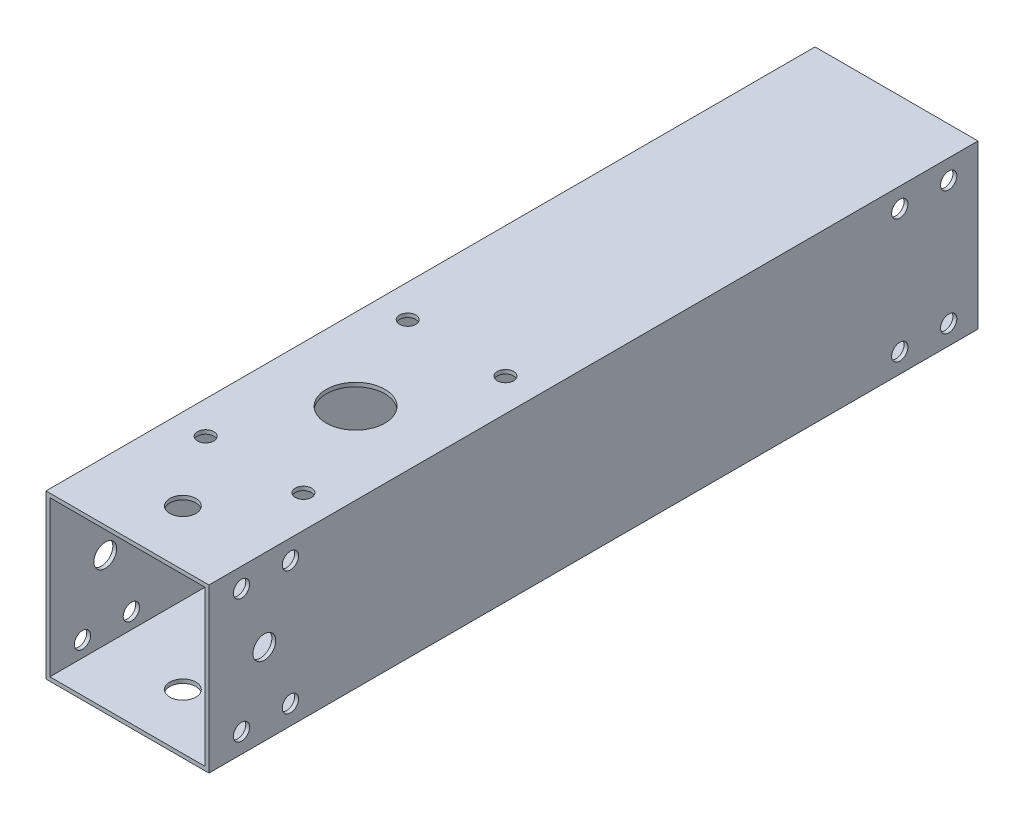
ISO-10303-21;
HEADER;
FILE_DESCRIPTION(('STEP AP214'),'2;1');
FILE_NAME('part.step','',(''),(''),'','','');
FILE_SCHEMA(('AUTOMOTIVE_DESIGN { 1 0 10303 214 1 1 1 1 }'));
ENDSEC;
DATA;
#1=APPLICATION_CONTEXT('core data for automotive mechanical design processes');
#2=APPLICATION_PROTOCOL_DEFINITION('international standard','automotive_design',2000,#1);
#3=PRODUCT_CONTEXT('',#1,'mechanical');
#4=PRODUCT('Part','Part','',(#3));
#5=PRODUCT_RELATED_PRODUCT_CATEGORY('part','',(#4));
#6=PRODUCT_DEFINITION_FORMATION('','',#4);
#7=PRODUCT_DEFINITION_CONTEXT('part definition',#1,'design');
#8=PRODUCT_DEFINITION('design','',#6,#7);
#9=PRODUCT_DEFINITION_SHAPE('','',#8);
#10=(LENGTH_UNIT() NAMED_UNIT(*) SI_UNIT(.MILLI.,.METRE.));
#11=(NAMED_UNIT(*) PLANE_ANGLE_UNIT() SI_UNIT($,.RADIAN.));
#12=(NAMED_UNIT(*) SI_UNIT($,.STERADIAN.) SOLID_ANGLE_UNIT());
#13=UNCERTAINTY_MEASURE_WITH_UNIT(LENGTH_MEASURE(1.E-05),#10,'distance_accuracy_value','');
#14=(GEOMETRIC_REPRESENTATION_CONTEXT(3) GLOBAL_UNCERTAINTY_ASSIGNED_CONTEXT((#13)) GLOBAL_UNIT_ASSIGNED_CONTEXT((#10,
#11,#12)) REPRESENTATION_CONTEXT('',''));
#15=CARTESIAN_POINT('',(0.,0.,0.));
#16=DIRECTION('',(0.,0.,1.));
#17=DIRECTION('',(1.,0.,0.));
#18=AXIS2_PLACEMENT_3D('',#15,#16,#17);
#19=CARTESIAN_POINT('',(0.,0.,237.));
#20=DIRECTION('',(0.,0.,1.));
#21=DIRECTION('',(1.,0.,0.));
#22=AXIS2_PLACEMENT_3D('',#19,#20,#21);
#23=PLANE('',#22);
#24=DIRECTION('',(0.,1.,0.));
#25=VECTOR('',#24,1.);
#26=CARTESIAN_POINT('',(25.,25.,237.));
#27=LINE('',#26,#25);
#28=CARTESIAN_POINT('',(25.,-25.,237.));
#29=VERTEX_POINT('',#28);
#30=CARTESIAN_POINT('',(25.,25.,237.));
#31=VERTEX_POINT('',#30);
#32=EDGE_CURVE('E131',#29,#31,#27,.T.);
#33=ORIENTED_EDGE('',*,*,#32,.T.);
#34=DIRECTION('',(-1.,0.,0.));
#35=VECTOR('',#34,1.);
#36=CARTESIAN_POINT('',(-25.,25.,237.));
#37=LINE('',#36,#35);
#38=CARTESIAN_POINT('',(-25.,25.,237.));
#39=VERTEX_POINT('',#38);
#40=EDGE_CURVE('E158',#31,#39,#37,.T.);
#41=ORIENTED_EDGE('',*,*,#40,.T.);
#42=DIRECTION('',(0.,-1.,0.));
#43=VECTOR('',#42,1.);
#44=CARTESIAN_POINT('',(-25.,25.,237.));
#45=LINE('',#44,#43);
#46=CARTESIAN_POINT('',(-25.,-25.,237.));
#47=VERTEX_POINT('',#46);
#48=EDGE_CURVE('E160',#39,#47,#45,.T.);
#49=ORIENTED_EDGE('',*,*,#48,.T.);
#50=DIRECTION('',(1.,0.,0.));
#51=VECTOR('',#50,1.);
#52=CARTESIAN_POINT('',(-25.,-25.,237.));
#53=LINE('',#52,#51);
#54=EDGE_CURVE('E162',#47,#29,#53,.T.);
#55=ORIENTED_EDGE('',*,*,#54,.T.);
#56=EDGE_LOOP('',(#33,#41,#49,#55));
#57=FACE_BOUND('',#56,.T.);
#58=DIRECTION('',(0.,-1.,0.));
#59=VECTOR('',#58,1.);
#60=CARTESIAN_POINT('',(-23.8,23.8,237.));
#61=LINE('',#60,#59);
#62=CARTESIAN_POINT('',(-23.8,23.8,237.));
#63=VERTEX_POINT('',#62);
#64=CARTESIAN_POINT('',(-23.8,-23.8,237.));
#65=VERTEX_POINT('',#64);
#66=EDGE_CURVE('E123',#63,#65,#61,.T.);
#67=ORIENTED_EDGE('',*,*,#66,.F.);
#68=DIRECTION('',(-1.,0.,0.));
#69=VECTOR('',#68,1.);
#70=CARTESIAN_POINT('',(-23.8,23.8,237.));
#71=LINE('',#70,#69);
#72=CARTESIAN_POINT('',(23.8,23.8,237.));
#73=VERTEX_POINT('',#72);
#74=EDGE_CURVE('E113',#73,#63,#71,.T.);
#75=ORIENTED_EDGE('',*,*,#74,.F.);
#76=DIRECTION('',(0.,1.,0.));
#77=VECTOR('',#76,1.);
#78=CARTESIAN_POINT('',(23.8,23.8,237.));
#79=LINE('',#78,#77);
#80=CARTESIAN_POINT('',(23.8,-23.8,237.));
#81=VERTEX_POINT('',#80);
#82=EDGE_CURVE('E138',#81,#73,#79,.T.);
#83=ORIENTED_EDGE('',*,*,#82,.F.);
#84=DIRECTION('',(1.,0.,0.));
#85=VECTOR('',#84,1.);
#86=CARTESIAN_POINT('',(-23.8,-23.8,237.));
#87=LINE('',#86,#85);
#88=EDGE_CURVE('E136',#65,#81,#87,.T.);
#89=ORIENTED_EDGE('',*,*,#88,.F.);
#90=EDGE_LOOP('',(#67,#75,#83,#89));
#91=FACE_BOUND('',#90,.T.);
#92=ADVANCED_FACE('F33',(#57,#91),#23,.T.);
#93=CARTESIAN_POINT('',(0.,0.,0.));
#94=DIRECTION('',(0.,0.,1.));
#95=DIRECTION('',(1.,0.,0.));
#96=AXIS2_PLACEMENT_3D('',#93,#94,#95);
#97=PLANE('',#96);
#98=DIRECTION('',(-1.,0.,0.));
#99=VECTOR('',#98,1.);
#100=CARTESIAN_POINT('',(0.,-24.,0.));
#101=LINE('',#100,#99);
#102=CARTESIAN_POINT('',(24.,-24.,0.));
#103=VERTEX_POINT('',#102);
#104=CARTESIAN_POINT('',(-24.,-24.,0.));
#105=VERTEX_POINT('',#104);
#106=EDGE_CURVE('E220',#103,#105,#101,.T.);
#107=ORIENTED_EDGE('',*,*,#106,.T.);
#108=DIRECTION('',(0.,1.,0.));
#109=VECTOR('',#108,1.);
#110=CARTESIAN_POINT('',(-24.,0.,0.));
#111=LINE('',#110,#109);
#112=CARTESIAN_POINT('',(-24.,24.,0.));
#113=VERTEX_POINT('',#112);
#114=EDGE_CURVE('E226',#105,#113,#111,.T.);
#115=ORIENTED_EDGE('',*,*,#114,.T.);
#116=DIRECTION('',(1.,0.,0.));
#117=VECTOR('',#116,1.);
#118=CARTESIAN_POINT('',(0.,24.,0.));
#119=LINE('',#118,#117);
#120=CARTESIAN_POINT('',(24.,24.,0.));
#121=VERTEX_POINT('',#120);
#122=EDGE_CURVE('E224',#113,#121,#119,.T.);
#123=ORIENTED_EDGE('',*,*,#122,.T.);
#124=DIRECTION('',(0.,-1.,0.));
#125=VECTOR('',#124,1.);
#126=CARTESIAN_POINT('',(24.,0.,0.));
#127=LINE('',#126,#125);
#128=EDGE_CURVE('E222',#121,#103,#127,.T.);
#129=ORIENTED_EDGE('',*,*,#128,.T.);
#130=EDGE_LOOP('',(#107,#115,#123,#129));
#131=FACE_BOUND('',#130,.T.);
#132=DIRECTION('',(-1.,0.,0.));
#133=VECTOR('',#132,1.);
#134=CARTESIAN_POINT('',(-23.8,23.8,0.));
#135=LINE('',#134,#133);
#136=CARTESIAN_POINT('',(23.8,23.8,0.));
#137=VERTEX_POINT('',#136);
#138=CARTESIAN_POINT('',(-23.8,23.8,0.));
#139=VERTEX_POINT('',#138);
#140=EDGE_CURVE('E143',#137,#139,#135,.T.);
#141=ORIENTED_EDGE('',*,*,#140,.T.);
#142=DIRECTION('',(0.,-1.,0.));
#143=VECTOR('',#142,1.);
#144=CARTESIAN_POINT('',(-23.8,23.8,0.));
#145=LINE('',#144,#143);
#146=CARTESIAN_POINT('',(-23.8,-23.8,0.));
#147=VERTEX_POINT('',#146);
#148=EDGE_CURVE('E130',#139,#147,#145,.T.);
#149=ORIENTED_EDGE('',*,*,#148,.T.);
#150=DIRECTION('',(1.,0.,0.));
#151=VECTOR('',#150,1.);
#152=CARTESIAN_POINT('',(-23.8,-23.8,0.));
#153=LINE('',#152,#151);
#154=CARTESIAN_POINT('',(23.8,-23.8,0.));
#155=VERTEX_POINT('',#154);
#156=EDGE_CURVE('E147',#147,#155,#153,.T.);
#157=ORIENTED_EDGE('',*,*,#156,.T.);
#158=DIRECTION('',(0.,1.,0.));
#159=VECTOR('',#158,1.);
#160=CARTESIAN_POINT('',(23.8,23.8,0.));
#161=LINE('',#160,#159);
#162=EDGE_CURVE('E124',#155,#137,#161,.T.);
#163=ORIENTED_EDGE('',*,*,#162,.T.);
#164=EDGE_LOOP('',(#141,#149,#157,#163));
#165=FACE_BOUND('',#164,.T.);
#166=ADVANCED_FACE('F375',(#131,#165),#97,.F.);
#167=CARTESIAN_POINT('',(25.,25.,237.));
#168=DIRECTION('',(-1.,0.,0.));
#169=DIRECTION('',(0.,-1.,0.));
#170=AXIS2_PLACEMENT_3D('',#167,#168,#169);
#171=PLANE('',#170);
#172=CARTESIAN_POINT('',(25.,0.,220.));
#173=DIRECTION('',(1.,0.,0.));
#174=DIRECTION('',(0.,1.,0.));
#175=AXIS2_PLACEMENT_3D('',#172,#173,#174);
#176=CIRCLE('',#175,3.49999999999999);
#177=CARTESIAN_POINT('',(25.,3.5,220.));
#178=VERTEX_POINT('',#177);
#179=EDGE_CURVE('E243',#178,#178,#176,.T.);
#180=ORIENTED_EDGE('',*,*,#179,.F.);
#181=EDGE_LOOP('',(#180));
#182=FACE_BOUND('',#181,.T.);
#183=CARTESIAN_POINT('',(25.,-19.,227.));
#184=DIRECTION('',(1.,0.,0.));
#185=DIRECTION('',(0.,1.,0.));
#186=AXIS2_PLACEMENT_3D('',#183,#184,#185);
#187=CIRCLE('',#186,2.5);
#188=CARTESIAN_POINT('',(25.,-16.5,227.));
#189=VERTEX_POINT('',#188);
#190=EDGE_CURVE('E297',#189,#189,#187,.T.);
#191=ORIENTED_EDGE('',*,*,#190,.F.);
#192=EDGE_LOOP('',(#191));
#193=FACE_BOUND('',#192,.T.);
#194=CARTESIAN_POINT('',(25.,-19.,212.));
#195=DIRECTION('',(1.,0.,0.));
#196=DIRECTION('',(0.,1.,0.));
#197=AXIS2_PLACEMENT_3D('',#194,#195,#196);
#198=CIRCLE('',#197,2.5);
#199=CARTESIAN_POINT('',(25.,-16.5,212.));
#200=VERTEX_POINT('',#199);
#201=EDGE_CURVE('E304',#200,#200,#198,.T.);
#202=ORIENTED_EDGE('',*,*,#201,.F.);
#203=EDGE_LOOP('',(#202));
#204=FACE_BOUND('',#203,.T.);
#205=CARTESIAN_POINT('',(25.,19.,212.));
#206=DIRECTION('',(1.,0.,0.));
#207=DIRECTION('',(0.,1.,0.));
#208=AXIS2_PLACEMENT_3D('',#205,#206,#207);
#209=CIRCLE('',#208,2.5);
#210=CARTESIAN_POINT('',(25.,21.5,212.));
#211=VERTEX_POINT('',#210);
#212=EDGE_CURVE('E311',#211,#211,#209,.T.);
#213=ORIENTED_EDGE('',*,*,#212,.F.);
#214=EDGE_LOOP('',(#213));
#215=FACE_BOUND('',#214,.T.);
#216=CARTESIAN_POINT('',(25.,19.,227.));
#217=DIRECTION('',(1.,0.,0.));
#218=DIRECTION('',(0.,1.,0.));
#219=AXIS2_PLACEMENT_3D('',#216,#217,#218);
#220=CIRCLE('',#219,2.5);
#221=CARTESIAN_POINT('',(25.,21.5,227.));
#222=VERTEX_POINT('',#221);
#223=EDGE_CURVE('E318',#222,#222,#220,.T.);
#224=ORIENTED_EDGE('',*,*,#223,.F.);
#225=EDGE_LOOP('',(#224));
#226=FACE_BOUND('',#225,.T.);
#227=CARTESIAN_POINT('',(25.,-19.,10.));
#228=DIRECTION('',(1.,0.,0.));
#229=DIRECTION('',(0.,1.,0.));
#230=AXIS2_PLACEMENT_3D('',#227,#228,#229);
#231=CIRCLE('',#230,2.5);
#232=CARTESIAN_POINT('',(25.,-16.5,10.));
#233=VERTEX_POINT('',#232);
#234=EDGE_CURVE('E325',#233,#233,#231,.T.);
#235=ORIENTED_EDGE('',*,*,#234,.F.);
#236=EDGE_LOOP('',(#235));
#237=FACE_BOUND('',#236,.T.);
#238=CARTESIAN_POINT('',(25.,-19.,25.));
#239=DIRECTION('',(1.,0.,0.));
#240=DIRECTION('',(0.,1.,0.));
#241=AXIS2_PLACEMENT_3D('',#238,#239,#240);
#242=CIRCLE('',#241,2.5);
#243=CARTESIAN_POINT('',(25.,-16.5,25.));
#244=VERTEX_POINT('',#243);
#245=EDGE_CURVE('E332',#244,#244,#242,.T.);
#246=ORIENTED_EDGE('',*,*,#245,.F.);
#247=EDGE_LOOP('',(#246));
#248=FACE_BOUND('',#247,.T.);
#249=CARTESIAN_POINT('',(25.,19.,25.));
#250=DIRECTION('',(1.,0.,0.));
#251=DIRECTION('',(0.,1.,0.));
#252=AXIS2_PLACEMENT_3D('',#249,#250,#251);
#253=CIRCLE('',#252,2.5);
#254=CARTESIAN_POINT('',(25.,21.5,25.));
#255=VERTEX_POINT('',#254);
#256=EDGE_CURVE('E339',#255,#255,#253,.T.);
#257=ORIENTED_EDGE('',*,*,#256,.F.);
#258=EDGE_LOOP('',(#257));
#259=FACE_BOUND('',#258,.T.);
#260=CARTESIAN_POINT('',(25.,19.,10.));
#261=DIRECTION('',(1.,0.,0.));
#262=DIRECTION('',(0.,1.,0.));
#263=AXIS2_PLACEMENT_3D('',#260,#261,#262);
#264=CIRCLE('',#263,2.5);
#265=CARTESIAN_POINT('',(25.,21.5,10.));
#266=VERTEX_POINT('',#265);
#267=EDGE_CURVE('E346',#266,#266,#264,.T.);
#268=ORIENTED_EDGE('',*,*,#267,.F.);
#269=EDGE_LOOP('',(#268));
#270=FACE_BOUND('',#269,.T.);
#271=DIRECTION('',(0.,0.,-1.));
#272=VECTOR('',#271,1.);
#273=CARTESIAN_POINT('',(25.,-25.,237.));
#274=LINE('',#273,#272);
#275=CARTESIAN_POINT('',(25.,-25.,1.));
#276=VERTEX_POINT('',#275);
#277=EDGE_CURVE('E164',#29,#276,#274,.T.);
#278=ORIENTED_EDGE('',*,*,#277,.T.);
#279=DIRECTION('',(0.,1.,0.));
#280=VECTOR('',#279,1.);
#281=CARTESIAN_POINT('',(25.,25.,1.));
#282=LINE('',#281,#280);
#283=CARTESIAN_POINT('',(25.,25.,1.));
#284=VERTEX_POINT('',#283);
#285=EDGE_CURVE('E42',#276,#284,#282,.T.);
#286=ORIENTED_EDGE('',*,*,#285,.T.);
#287=DIRECTION('',(0.,0.,-1.));
#288=VECTOR('',#287,1.);
#289=CARTESIAN_POINT('',(25.,25.,237.));
#290=LINE('',#289,#288);
#291=EDGE_CURVE('E171',#31,#284,#290,.T.);
#292=ORIENTED_EDGE('',*,*,#291,.F.);
#293=ORIENTED_EDGE('',*,*,#32,.F.);
#294=EDGE_LOOP('',(#278,#286,#292,#293));
#295=FACE_BOUND('',#294,.T.);
#296=ADVANCED_FACE('F381',(#182,#193,#204,#215,#226,#237,#248,#259,#270,#295),#171,.F.);
#297=CARTESIAN_POINT('',(-25.,25.,237.));
#298=DIRECTION('',(0.,-1.,0.));
#299=DIRECTION('',(0.,0.,-1.));
#300=AXIS2_PLACEMENT_3D('',#297,#298,#299);
#301=PLANE('',#300);
#302=CARTESIAN_POINT('',(15.,25.,198.));
#303=DIRECTION('',(0.,1.,0.));
#304=DIRECTION('',(0.,0.,1.));
#305=AXIS2_PLACEMENT_3D('',#302,#303,#304);
#306=CIRCLE('',#305,2.5);
#307=CARTESIAN_POINT('',(15.,25.,200.5));
#308=VERTEX_POINT('',#307);
#309=EDGE_CURVE('E273',#308,#308,#306,.T.);
#310=ORIENTED_EDGE('',*,*,#309,.F.);
#311=EDGE_LOOP('',(#310));
#312=FACE_BOUND('',#311,.T.);
#313=CARTESIAN_POINT('',(-15.,25.,198.));
#314=DIRECTION('',(0.,1.,0.));
#315=DIRECTION('',(0.,0.,1.));
#316=AXIS2_PLACEMENT_3D('',#313,#314,#315);
#317=CIRCLE('',#316,2.5);
#318=CARTESIAN_POINT('',(-15.,25.,200.5));
#319=VERTEX_POINT('',#318);
#320=EDGE_CURVE('E263',#319,#319,#317,.T.);
#321=ORIENTED_EDGE('',*,*,#320,.F.);
#322=EDGE_LOOP('',(#321));
#323=FACE_BOUND('',#322,.T.);
#324=CARTESIAN_POINT('',(15.,25.,136.));
#325=DIRECTION('',(0.,1.,0.));
#326=DIRECTION('',(0.,0.,1.));
#327=AXIS2_PLACEMENT_3D('',#324,#325,#326);
#328=CIRCLE('',#327,2.5);
#329=CARTESIAN_POINT('',(15.,25.,138.5));
#330=VERTEX_POINT('',#329);
#331=EDGE_CURVE('E260',#330,#330,#328,.T.);
#332=ORIENTED_EDGE('',*,*,#331,.F.);
#333=EDGE_LOOP('',(#332));
#334=FACE_BOUND('',#333,.T.);
#335=CARTESIAN_POINT('',(-15.,25.,136.));
#336=DIRECTION('',(0.,1.,0.));
#337=DIRECTION('',(0.,0.,1.));
#338=AXIS2_PLACEMENT_3D('',#335,#336,#337);
#339=CIRCLE('',#338,2.5);
#340=CARTESIAN_POINT('',(-15.,25.,138.5));
#341=VERTEX_POINT('',#340);
#342=EDGE_CURVE('E257',#341,#341,#339,.T.);
#343=ORIENTED_EDGE('',*,*,#342,.F.);
#344=EDGE_LOOP('',(#343));
#345=FACE_BOUND('',#344,.T.);
#346=CARTESIAN_POINT('',(0.,25.,167.));
#347=DIRECTION('',(0.,1.,0.));
#348=DIRECTION('',(0.,0.,1.));
#349=AXIS2_PLACEMENT_3D('',#346,#347,#348);
#350=CIRCLE('',#349,9.00000000000001);
#351=CARTESIAN_POINT('',(0.,25.,176.));
#352=VERTEX_POINT('',#351);
#353=EDGE_CURVE('E256',#352,#352,#350,.T.);
#354=ORIENTED_EDGE('',*,*,#353,.F.);
#355=EDGE_LOOP('',(#354));
#356=FACE_BOUND('',#355,.T.);
#357=CARTESIAN_POINT('',(0.,25.,220.));
#358=DIRECTION('',(0.,1.,0.));
#359=DIRECTION('',(0.,0.,1.));
#360=AXIS2_PLACEMENT_3D('',#357,#358,#359);
#361=CIRCLE('',#360,4.00000000000001);
#362=CARTESIAN_POINT('',(0.,25.,224.));
#363=VERTEX_POINT('',#362);
#364=EDGE_CURVE('E284',#363,#363,#361,.T.);
#365=ORIENTED_EDGE('',*,*,#364,.F.);
#366=EDGE_LOOP('',(#365));
#367=FACE_BOUND('',#366,.T.);
#368=ORIENTED_EDGE('',*,*,#291,.T.);
#369=DIRECTION('',(-1.,0.,0.));
#370=VECTOR('',#369,1.);
#371=CARTESIAN_POINT('',(-25.,25.,1.));
#372=LINE('',#371,#370);
#373=CARTESIAN_POINT('',(-25.,25.,1.));
#374=VERTEX_POINT('',#373);
#375=EDGE_CURVE('E229',#284,#374,#372,.T.);
#376=ORIENTED_EDGE('',*,*,#375,.T.);
#377=DIRECTION('',(0.,0.,-1.));
#378=VECTOR('',#377,1.);
#379=CARTESIAN_POINT('',(-25.,25.,237.));
#380=LINE('',#379,#378);
#381=EDGE_CURVE('E168',#39,#374,#380,.T.);
#382=ORIENTED_EDGE('',*,*,#381,.F.);
#383=ORIENTED_EDGE('',*,*,#40,.F.);
#384=EDGE_LOOP('',(#368,#376,#382,#383));
#385=FACE_BOUND('',#384,.T.);
#386=ADVANCED_FACE('F391',(#312,#323,#334,#345,#356,#367,#385),#301,.F.);
#387=CARTESIAN_POINT('',(-25.,25.,237.));
#388=DIRECTION('',(1.,0.,0.));
#389=DIRECTION('',(0.,1.,0.));
#390=AXIS2_PLACEMENT_3D('',#387,#388,#389);
#391=PLANE('',#390);
#392=CARTESIAN_POINT('',(-25.,0.,220.));
#393=DIRECTION('',(1.,0.,0.));
#394=DIRECTION('',(0.,1.,0.));
#395=AXIS2_PLACEMENT_3D('',#392,#393,#394);
#396=CIRCLE('',#395,3.49999999999999);
#397=CARTESIAN_POINT('',(-25.,3.49999999999999,220.));
#398=VERTEX_POINT('',#397);
#399=EDGE_CURVE('E217',#398,#398,#396,.T.);
#400=ORIENTED_EDGE('',*,*,#399,.T.);
#401=EDGE_LOOP('',(#400));
#402=FACE_BOUND('',#401,.T.);
#403=CARTESIAN_POINT('',(-25.,-19.,227.));
#404=DIRECTION('',(1.,0.,0.));
#405=DIRECTION('',(0.,1.,0.));
#406=AXIS2_PLACEMENT_3D('',#403,#404,#405);
#407=CIRCLE('',#406,2.5);
#408=CARTESIAN_POINT('',(-25.,-16.5,227.));
#409=VERTEX_POINT('',#408);
#410=EDGE_CURVE('E212',#409,#409,#407,.T.);
#411=ORIENTED_EDGE('',*,*,#410,.T.);
#412=EDGE_LOOP('',(#411));
#413=FACE_BOUND('',#412,.T.);
#414=CARTESIAN_POINT('',(-25.,-19.,212.));
#415=DIRECTION('',(1.,0.,0.));
#416=DIRECTION('',(0.,1.,0.));
#417=AXIS2_PLACEMENT_3D('',#414,#415,#416);
#418=CIRCLE('',#417,2.5);
#419=CARTESIAN_POINT('',(-25.,-16.5,212.));
#420=VERTEX_POINT('',#419);
#421=EDGE_CURVE('E207',#420,#420,#418,.T.);
#422=ORIENTED_EDGE('',*,*,#421,.T.);
#423=EDGE_LOOP('',(#422));
#424=FACE_BOUND('',#423,.T.);
#425=CARTESIAN_POINT('',(-25.,19.,212.));
#426=DIRECTION('',(1.,0.,0.));
#427=DIRECTION('',(0.,1.,0.));
#428=AXIS2_PLACEMENT_3D('',#425,#426,#427);
#429=CIRCLE('',#428,2.5);
#430=CARTESIAN_POINT('',(-25.,21.5,212.));
#431=VERTEX_POINT('',#430);
#432=EDGE_CURVE('E202',#431,#431,#429,.T.);
#433=ORIENTED_EDGE('',*,*,#432,.T.);
#434=EDGE_LOOP('',(#433));
#435=FACE_BOUND('',#434,.T.);
#436=CARTESIAN_POINT('',(-25.,19.,227.));
#437=DIRECTION('',(1.,0.,0.));
#438=DIRECTION('',(0.,1.,0.));
#439=AXIS2_PLACEMENT_3D('',#436,#437,#438);
#440=CIRCLE('',#439,2.5);
#441=CARTESIAN_POINT('',(-25.,21.5,227.));
#442=VERTEX_POINT('',#441);
#443=EDGE_CURVE('E197',#442,#442,#440,.T.);
#444=ORIENTED_EDGE('',*,*,#443,.T.);
#445=EDGE_LOOP('',(#444));
#446=FACE_BOUND('',#445,.T.);
#447=CARTESIAN_POINT('',(-25.,-19.,10.));
#448=DIRECTION('',(1.,0.,0.));
#449=DIRECTION('',(0.,1.,0.));
#450=AXIS2_PLACEMENT_3D('',#447,#448,#449);
#451=CIRCLE('',#450,2.5);
#452=CARTESIAN_POINT('',(-25.,-16.5,10.));
#453=VERTEX_POINT('',#452);
#454=EDGE_CURVE('E192',#453,#453,#451,.T.);
#455=ORIENTED_EDGE('',*,*,#454,.T.);
#456=EDGE_LOOP('',(#455));
#457=FACE_BOUND('',#456,.T.);
#458=CARTESIAN_POINT('',(-25.,-19.,25.));
#459=DIRECTION('',(1.,0.,0.));
#460=DIRECTION('',(0.,1.,0.));
#461=AXIS2_PLACEMENT_3D('',#458,#459,#460);
#462=CIRCLE('',#461,2.5);
#463=CARTESIAN_POINT('',(-25.,-16.5,25.));
#464=VERTEX_POINT('',#463);
#465=EDGE_CURVE('E187',#464,#464,#462,.T.);
#466=ORIENTED_EDGE('',*,*,#465,.T.);
#467=EDGE_LOOP('',(#466));
#468=FACE_BOUND('',#467,.T.);
#469=CARTESIAN_POINT('',(-25.,19.,25.));
#470=DIRECTION('',(1.,0.,0.));
#471=DIRECTION('',(0.,1.,0.));
#472=AXIS2_PLACEMENT_3D('',#469,#470,#471);
#473=CIRCLE('',#472,2.5);
#474=CARTESIAN_POINT('',(-25.,21.5,25.));
#475=VERTEX_POINT('',#474);
#476=EDGE_CURVE('E182',#475,#475,#473,.T.);
#477=ORIENTED_EDGE('',*,*,#476,.T.);
#478=EDGE_LOOP('',(#477));
#479=FACE_BOUND('',#478,.T.);
#480=CARTESIAN_POINT('',(-25.,19.,10.));
#481=DIRECTION('',(1.,0.,0.));
#482=DIRECTION('',(0.,1.,0.));
#483=AXIS2_PLACEMENT_3D('',#480,#481,#482);
#484=CIRCLE('',#483,2.5);
#485=CARTESIAN_POINT('',(-25.,21.5,10.));
#486=VERTEX_POINT('',#485);
#487=EDGE_CURVE('E177',#486,#486,#484,.T.);
#488=ORIENTED_EDGE('',*,*,#487,.T.);
#489=EDGE_LOOP('',(#488));
#490=FACE_BOUND('',#489,.T.);
#491=ORIENTED_EDGE('',*,*,#381,.T.);
#492=DIRECTION('',(0.,-1.,0.));
#493=VECTOR('',#492,1.);
#494=CARTESIAN_POINT('',(-25.,25.,1.));
#495=LINE('',#494,#493);
#496=CARTESIAN_POINT('',(-25.,-25.,1.));
#497=VERTEX_POINT('',#496);
#498=EDGE_CURVE('E173',#374,#497,#495,.T.);
#499=ORIENTED_EDGE('',*,*,#498,.T.);
#500=DIRECTION('',(0.,0.,-1.));
#501=VECTOR('',#500,1.);
#502=CARTESIAN_POINT('',(-25.,-25.,237.));
#503=LINE('',#502,#501);
#504=EDGE_CURVE('E166',#47,#497,#503,.T.);
#505=ORIENTED_EDGE('',*,*,#504,.F.);
#506=ORIENTED_EDGE('',*,*,#48,.F.);
#507=EDGE_LOOP('',(#491,#499,#505,#506));
#508=FACE_BOUND('',#507,.T.);
#509=ADVANCED_FACE('F387',(#402,#413,#424,#435,#446,#457,#468,#479,#490,#508),#391,.F.);
#510=CARTESIAN_POINT('',(-25.,-25.,237.));
#511=DIRECTION('',(0.,1.,0.));
#512=DIRECTION('',(0.,0.,1.));
#513=AXIS2_PLACEMENT_3D('',#510,#511,#512);
#514=PLANE('',#513);
#515=CARTESIAN_POINT('',(0.,-25.,167.));
#516=DIRECTION('',(0.,1.,0.));
#517=DIRECTION('',(0.,0.,1.));
#518=AXIS2_PLACEMENT_3D('',#515,#516,#517);
#519=CIRCLE('',#518,9.00000000000001);
#520=CARTESIAN_POINT('',(0.,-25.,176.));
#521=VERTEX_POINT('',#520);
#522=EDGE_CURVE('E252',#521,#521,#519,.T.);
#523=ORIENTED_EDGE('',*,*,#522,.T.);
#524=EDGE_LOOP('',(#523));
#525=FACE_BOUND('',#524,.T.);
#526=CARTESIAN_POINT('',(0.,-25.,220.));
#527=DIRECTION('',(0.,1.,0.));
#528=DIRECTION('',(0.,0.,1.));
#529=AXIS2_PLACEMENT_3D('',#526,#527,#528);
#530=CIRCLE('',#529,4.00000000000001);
#531=CARTESIAN_POINT('',(0.,-25.,224.));
#532=VERTEX_POINT('',#531);
#533=EDGE_CURVE('E247',#532,#532,#530,.T.);
#534=ORIENTED_EDGE('',*,*,#533,.T.);
#535=EDGE_LOOP('',(#534));
#536=FACE_BOUND('',#535,.T.);
#537=ORIENTED_EDGE('',*,*,#504,.T.);
#538=DIRECTION('',(1.,0.,0.));
#539=VECTOR('',#538,1.);
#540=CARTESIAN_POINT('',(-25.,-25.,1.));
#541=LINE('',#540,#539);
#542=EDGE_CURVE('E11',#497,#276,#541,.T.);
#543=ORIENTED_EDGE('',*,*,#542,.T.);
#544=ORIENTED_EDGE('',*,*,#277,.F.);
#545=ORIENTED_EDGE('',*,*,#54,.F.);
#546=EDGE_LOOP('',(#537,#543,#544,#545));
#547=FACE_BOUND('',#546,.T.);
#548=ADVANCED_FACE('F369',(#525,#536,#547),#514,.F.);
#549=CARTESIAN_POINT('',(-23.8,23.8,237.));
#550=DIRECTION('',(0.,-1.,0.));
#551=DIRECTION('',(0.,0.,-1.));
#552=AXIS2_PLACEMENT_3D('',#549,#550,#551);
#553=PLANE('',#552);
#554=CARTESIAN_POINT('',(15.,23.8,198.));
#555=DIRECTION('',(0.,-1.,0.));
#556=DIRECTION('',(0.,0.,-1.));
#557=AXIS2_PLACEMENT_3D('',#554,#555,#556);
#558=CIRCLE('',#557,2.5);
#559=CARTESIAN_POINT('',(15.,23.8,195.5));
#560=VERTEX_POINT('',#559);
#561=EDGE_CURVE('E37',#560,#560,#558,.T.);
#562=ORIENTED_EDGE('',*,*,#561,.F.);
#563=EDGE_LOOP('',(#562));
#564=FACE_BOUND('',#563,.T.);
#565=CARTESIAN_POINT('',(-15.,23.8,198.));
#566=DIRECTION('',(0.,-1.,0.));
#567=DIRECTION('',(0.,0.,-1.));
#568=AXIS2_PLACEMENT_3D('',#565,#566,#567);
#569=CIRCLE('',#568,2.5);
#570=CARTESIAN_POINT('',(-15.,23.8,195.5));
#571=VERTEX_POINT('',#570);
#572=EDGE_CURVE('E261',#571,#571,#569,.T.);
#573=ORIENTED_EDGE('',*,*,#572,.F.);
#574=EDGE_LOOP('',(#573));
#575=FACE_BOUND('',#574,.T.);
#576=CARTESIAN_POINT('',(15.,23.8,136.));
#577=DIRECTION('',(0.,-1.,0.));
#578=DIRECTION('',(0.,0.,-1.));
#579=AXIS2_PLACEMENT_3D('',#576,#577,#578);
#580=CIRCLE('',#579,2.5);
#581=CARTESIAN_POINT('',(15.,23.8,133.5));
#582=VERTEX_POINT('',#581);
#583=EDGE_CURVE('E258',#582,#582,#580,.T.);
#584=ORIENTED_EDGE('',*,*,#583,.F.);
#585=EDGE_LOOP('',(#584));
#586=FACE_BOUND('',#585,.T.);
#587=CARTESIAN_POINT('',(-15.,23.8,136.));
#588=DIRECTION('',(0.,-1.,0.));
#589=DIRECTION('',(0.,0.,-1.));
#590=AXIS2_PLACEMENT_3D('',#587,#588,#589);
#591=CIRCLE('',#590,2.5);
#592=CARTESIAN_POINT('',(-15.,23.8,133.5));
#593=VERTEX_POINT('',#592);
#594=EDGE_CURVE('E253',#593,#593,#591,.T.);
#595=ORIENTED_EDGE('',*,*,#594,.F.);
#596=EDGE_LOOP('',(#595));
#597=FACE_BOUND('',#596,.T.);
#598=CARTESIAN_POINT('',(0.,23.8,167.));
#599=DIRECTION('',(0.,-1.,0.));
#600=DIRECTION('',(0.,0.,-1.));
#601=AXIS2_PLACEMENT_3D('',#598,#599,#600);
#602=CIRCLE('',#601,9.00000000000001);
#603=CARTESIAN_POINT('',(0.,23.8,158.));
#604=VERTEX_POINT('',#603);
#605=EDGE_CURVE('E251',#604,#604,#602,.T.);
#606=ORIENTED_EDGE('',*,*,#605,.F.);
#607=EDGE_LOOP('',(#606));
#608=FACE_BOUND('',#607,.T.);
#609=CARTESIAN_POINT('',(0.,23.8,220.));
#610=DIRECTION('',(0.,-1.,0.));
#611=DIRECTION('',(0.,0.,-1.));
#612=AXIS2_PLACEMENT_3D('',#609,#610,#611);
#613=CIRCLE('',#612,4.00000000000001);
#614=CARTESIAN_POINT('',(0.,23.8,216.));
#615=VERTEX_POINT('',#614);
#616=EDGE_CURVE('E235',#615,#615,#613,.T.);
#617=ORIENTED_EDGE('',*,*,#616,.F.);
#618=EDGE_LOOP('',(#617));
#619=FACE_BOUND('',#618,.T.);
#620=ORIENTED_EDGE('',*,*,#140,.F.);
#621=DIRECTION('',(0.,0.,-1.));
#622=VECTOR('',#621,1.);
#623=CARTESIAN_POINT('',(23.8,23.8,237.));
#624=LINE('',#623,#622);
#625=EDGE_CURVE('E119',#73,#137,#624,.T.);
#626=ORIENTED_EDGE('',*,*,#625,.F.);
#627=ORIENTED_EDGE('',*,*,#74,.T.);
#628=DIRECTION('',(0.,0.,-1.));
#629=VECTOR('',#628,1.);
#630=CARTESIAN_POINT('',(-23.8,23.8,237.));
#631=LINE('',#630,#629);
#632=EDGE_CURVE('E116',#63,#139,#631,.T.);
#633=ORIENTED_EDGE('',*,*,#632,.T.);
#634=EDGE_LOOP('',(#620,#626,#627,#633));
#635=FACE_BOUND('',#634,.T.);
#636=ADVANCED_FACE('F115',(#564,#575,#586,#597,#608,#619,#635),#553,.T.);
#637=CARTESIAN_POINT('',(-23.8,23.8,237.));
#638=DIRECTION('',(1.,0.,0.));
#639=DIRECTION('',(0.,1.,0.));
#640=AXIS2_PLACEMENT_3D('',#637,#638,#639);
#641=PLANE('',#640);
#642=CARTESIAN_POINT('',(-23.8,0.,220.));
#643=DIRECTION('',(1.,0.,0.));
#644=DIRECTION('',(0.,1.,0.));
#645=AXIS2_PLACEMENT_3D('',#642,#643,#644);
#646=CIRCLE('',#645,3.49999999999999);
#647=CARTESIAN_POINT('',(-23.8,3.49999999999999,220.));
#648=VERTEX_POINT('',#647);
#649=EDGE_CURVE('E216',#648,#648,#646,.T.);
#650=ORIENTED_EDGE('',*,*,#649,.F.);
#651=EDGE_LOOP('',(#650));
#652=FACE_BOUND('',#651,.T.);
#653=CARTESIAN_POINT('',(-23.8,-19.,227.));
#654=DIRECTION('',(1.,0.,0.));
#655=DIRECTION('',(0.,1.,0.));
#656=AXIS2_PLACEMENT_3D('',#653,#654,#655);
#657=CIRCLE('',#656,2.5);
#658=CARTESIAN_POINT('',(-23.8,-16.5,227.));
#659=VERTEX_POINT('',#658);
#660=EDGE_CURVE('E211',#659,#659,#657,.T.);
#661=ORIENTED_EDGE('',*,*,#660,.F.);
#662=EDGE_LOOP('',(#661));
#663=FACE_BOUND('',#662,.T.);
#664=CARTESIAN_POINT('',(-23.8,-19.,212.));
#665=DIRECTION('',(1.,0.,0.));
#666=DIRECTION('',(0.,1.,0.));
#667=AXIS2_PLACEMENT_3D('',#664,#665,#666);
#668=CIRCLE('',#667,2.5);
#669=CARTESIAN_POINT('',(-23.8,-16.5,212.));
#670=VERTEX_POINT('',#669);
#671=EDGE_CURVE('E206',#670,#670,#668,.T.);
#672=ORIENTED_EDGE('',*,*,#671,.F.);
#673=EDGE_LOOP('',(#672));
#674=FACE_BOUND('',#673,.T.);
#675=CARTESIAN_POINT('',(-23.8,19.,212.));
#676=DIRECTION('',(1.,0.,0.));
#677=DIRECTION('',(0.,1.,0.));
#678=AXIS2_PLACEMENT_3D('',#675,#676,#677);
#679=CIRCLE('',#678,2.5);
#680=CARTESIAN_POINT('',(-23.8,21.5,212.));
#681=VERTEX_POINT('',#680);
#682=EDGE_CURVE('E201',#681,#681,#679,.T.);
#683=ORIENTED_EDGE('',*,*,#682,.F.);
#684=EDGE_LOOP('',(#683));
#685=FACE_BOUND('',#684,.T.);
#686=CARTESIAN_POINT('',(-23.8,19.,227.));
#687=DIRECTION('',(1.,0.,0.));
#688=DIRECTION('',(0.,1.,0.));
#689=AXIS2_PLACEMENT_3D('',#686,#687,#688);
#690=CIRCLE('',#689,2.5);
#691=CARTESIAN_POINT('',(-23.8,21.5,227.));
#692=VERTEX_POINT('',#691);
#693=EDGE_CURVE('E196',#692,#692,#690,.T.);
#694=ORIENTED_EDGE('',*,*,#693,.F.);
#695=EDGE_LOOP('',(#694));
#696=FACE_BOUND('',#695,.T.);
#697=CARTESIAN_POINT('',(-23.8,-19.,10.));
#698=DIRECTION('',(1.,0.,0.));
#699=DIRECTION('',(0.,1.,0.));
#700=AXIS2_PLACEMENT_3D('',#697,#698,#699);
#701=CIRCLE('',#700,2.5);
#702=CARTESIAN_POINT('',(-23.8,-16.5,10.));
#703=VERTEX_POINT('',#702);
#704=EDGE_CURVE('E191',#703,#703,#701,.T.);
#705=ORIENTED_EDGE('',*,*,#704,.F.);
#706=EDGE_LOOP('',(#705));
#707=FACE_BOUND('',#706,.T.);
#708=CARTESIAN_POINT('',(-23.8,-19.,25.));
#709=DIRECTION('',(1.,0.,0.));
#710=DIRECTION('',(0.,1.,0.));
#711=AXIS2_PLACEMENT_3D('',#708,#709,#710);
#712=CIRCLE('',#711,2.5);
#713=CARTESIAN_POINT('',(-23.8,-16.5,25.));
#714=VERTEX_POINT('',#713);
#715=EDGE_CURVE('E186',#714,#714,#712,.T.);
#716=ORIENTED_EDGE('',*,*,#715,.F.);
#717=EDGE_LOOP('',(#716));
#718=FACE_BOUND('',#717,.T.);
#719=CARTESIAN_POINT('',(-23.8,19.,25.));
#720=DIRECTION('',(1.,0.,0.));
#721=DIRECTION('',(0.,1.,0.));
#722=AXIS2_PLACEMENT_3D('',#719,#720,#721);
#723=CIRCLE('',#722,2.5);
#724=CARTESIAN_POINT('',(-23.8,21.5,25.));
#725=VERTEX_POINT('',#724);
#726=EDGE_CURVE('E181',#725,#725,#723,.T.);
#727=ORIENTED_EDGE('',*,*,#726,.F.);
#728=EDGE_LOOP('',(#727));
#729=FACE_BOUND('',#728,.T.);
#730=CARTESIAN_POINT('',(-23.8,19.,10.));
#731=DIRECTION('',(1.,0.,0.));
#732=DIRECTION('',(0.,1.,0.));
#733=AXIS2_PLACEMENT_3D('',#730,#731,#732);
#734=CIRCLE('',#733,2.5);
#735=CARTESIAN_POINT('',(-23.8,21.5,10.));
#736=VERTEX_POINT('',#735);
#737=EDGE_CURVE('E145',#736,#736,#734,.T.);
#738=ORIENTED_EDGE('',*,*,#737,.F.);
#739=EDGE_LOOP('',(#738));
#740=FACE_BOUND('',#739,.T.);
#741=ORIENTED_EDGE('',*,*,#148,.F.);
#742=ORIENTED_EDGE('',*,*,#632,.F.);
#743=ORIENTED_EDGE('',*,*,#66,.T.);
#744=DIRECTION('',(0.,0.,-1.));
#745=VECTOR('',#744,1.);
#746=CARTESIAN_POINT('',(-23.8,-23.8,237.));
#747=LINE('',#746,#745);
#748=EDGE_CURVE('E132',#65,#147,#747,.T.);
#749=ORIENTED_EDGE('',*,*,#748,.T.);
#750=EDGE_LOOP('',(#741,#742,#743,#749));
#751=FACE_BOUND('',#750,.T.);
#752=ADVANCED_FACE('F127',(#652,#663,#674,#685,#696,#707,#718,#729,#740,#751),#641,.T.);
#753=CARTESIAN_POINT('',(-23.8,-23.8,237.));
#754=DIRECTION('',(0.,1.,0.));
#755=DIRECTION('',(0.,0.,1.));
#756=AXIS2_PLACEMENT_3D('',#753,#754,#755);
#757=PLANE('',#756);
#758=CARTESIAN_POINT('',(0.,-23.8,167.));
#759=DIRECTION('',(0.,1.,0.));
#760=DIRECTION('',(0.,0.,1.));
#761=AXIS2_PLACEMENT_3D('',#758,#759,#760);
#762=CIRCLE('',#761,9.00000000000001);
#763=CARTESIAN_POINT('',(0.,-23.8,176.));
#764=VERTEX_POINT('',#763);
#765=EDGE_CURVE('E248',#764,#764,#762,.T.);
#766=ORIENTED_EDGE('',*,*,#765,.F.);
#767=EDGE_LOOP('',(#766));
#768=FACE_BOUND('',#767,.T.);
#769=CARTESIAN_POINT('',(0.,-23.8,220.));
#770=DIRECTION('',(0.,1.,0.));
#771=DIRECTION('',(0.,0.,1.));
#772=AXIS2_PLACEMENT_3D('',#769,#770,#771);
#773=CIRCLE('',#772,4.00000000000001);
#774=CARTESIAN_POINT('',(0.,-23.8,224.));
#775=VERTEX_POINT('',#774);
#776=EDGE_CURVE('E244',#775,#775,#773,.T.);
#777=ORIENTED_EDGE('',*,*,#776,.F.);
#778=EDGE_LOOP('',(#777));
#779=FACE_BOUND('',#778,.T.);
#780=ORIENTED_EDGE('',*,*,#156,.F.);
#781=ORIENTED_EDGE('',*,*,#748,.F.);
#782=ORIENTED_EDGE('',*,*,#88,.T.);
#783=DIRECTION('',(0.,0.,-1.));
#784=VECTOR('',#783,1.);
#785=CARTESIAN_POINT('',(23.8,-23.8,237.));
#786=LINE('',#785,#784);
#787=EDGE_CURVE('E153',#81,#155,#786,.T.);
#788=ORIENTED_EDGE('',*,*,#787,.T.);
#789=EDGE_LOOP('',(#780,#781,#782,#788));
#790=FACE_BOUND('',#789,.T.);
#791=ADVANCED_FACE('F357',(#768,#779,#790),#757,.T.);
#792=CARTESIAN_POINT('',(23.8,23.8,237.));
#793=DIRECTION('',(-1.,0.,0.));
#794=DIRECTION('',(0.,-1.,0.));
#795=AXIS2_PLACEMENT_3D('',#792,#793,#794);
#796=PLANE('',#795);
#797=CARTESIAN_POINT('',(23.8,0.,220.));
#798=DIRECTION('',(-1.,0.,0.));
#799=DIRECTION('',(0.,-1.,0.));
#800=AXIS2_PLACEMENT_3D('',#797,#798,#799);
#801=CIRCLE('',#800,3.49999999999999);
#802=CARTESIAN_POINT('',(23.8,-3.49999999999999,220.));
#803=VERTEX_POINT('',#802);
#804=EDGE_CURVE('E213',#803,#803,#801,.T.);
#805=ORIENTED_EDGE('',*,*,#804,.F.);
#806=EDGE_LOOP('',(#805));
#807=FACE_BOUND('',#806,.T.);
#808=CARTESIAN_POINT('',(23.8,-19.,227.));
#809=DIRECTION('',(-1.,0.,0.));
#810=DIRECTION('',(0.,-1.,0.));
#811=AXIS2_PLACEMENT_3D('',#808,#809,#810);
#812=CIRCLE('',#811,2.5);
#813=CARTESIAN_POINT('',(23.8,-21.5,227.));
#814=VERTEX_POINT('',#813);
#815=EDGE_CURVE('E208',#814,#814,#812,.T.);
#816=ORIENTED_EDGE('',*,*,#815,.F.);
#817=EDGE_LOOP('',(#816));
#818=FACE_BOUND('',#817,.T.);
#819=CARTESIAN_POINT('',(23.8,-19.,212.));
#820=DIRECTION('',(-1.,0.,0.));
#821=DIRECTION('',(0.,-1.,0.));
#822=AXIS2_PLACEMENT_3D('',#819,#820,#821);
#823=CIRCLE('',#822,2.5);
#824=CARTESIAN_POINT('',(23.8,-21.5,212.));
#825=VERTEX_POINT('',#824);
#826=EDGE_CURVE('E203',#825,#825,#823,.T.);
#827=ORIENTED_EDGE('',*,*,#826,.F.);
#828=EDGE_LOOP('',(#827));
#829=FACE_BOUND('',#828,.T.);
#830=CARTESIAN_POINT('',(23.8,19.,212.));
#831=DIRECTION('',(-1.,0.,0.));
#832=DIRECTION('',(0.,-1.,0.));
#833=AXIS2_PLACEMENT_3D('',#830,#831,#832);
#834=CIRCLE('',#833,2.5);
#835=CARTESIAN_POINT('',(23.8,16.5,212.));
#836=VERTEX_POINT('',#835);
#837=EDGE_CURVE('E198',#836,#836,#834,.T.);
#838=ORIENTED_EDGE('',*,*,#837,.F.);
#839=EDGE_LOOP('',(#838));
#840=FACE_BOUND('',#839,.T.);
#841=CARTESIAN_POINT('',(23.8,19.,227.));
#842=DIRECTION('',(-1.,0.,0.));
#843=DIRECTION('',(0.,-1.,0.));
#844=AXIS2_PLACEMENT_3D('',#841,#842,#843);
#845=CIRCLE('',#844,2.5);
#846=CARTESIAN_POINT('',(23.8,16.5,227.));
#847=VERTEX_POINT('',#846);
#848=EDGE_CURVE('E193',#847,#847,#845,.T.);
#849=ORIENTED_EDGE('',*,*,#848,.F.);
#850=EDGE_LOOP('',(#849));
#851=FACE_BOUND('',#850,.T.);
#852=CARTESIAN_POINT('',(23.8,-19.,10.));
#853=DIRECTION('',(-1.,0.,0.));
#854=DIRECTION('',(0.,-1.,0.));
#855=AXIS2_PLACEMENT_3D('',#852,#853,#854);
#856=CIRCLE('',#855,2.5);
#857=CARTESIAN_POINT('',(23.8,-21.5,10.));
#858=VERTEX_POINT('',#857);
#859=EDGE_CURVE('E188',#858,#858,#856,.T.);
#860=ORIENTED_EDGE('',*,*,#859,.F.);
#861=EDGE_LOOP('',(#860));
#862=FACE_BOUND('',#861,.T.);
#863=CARTESIAN_POINT('',(23.8,-19.,25.));
#864=DIRECTION('',(-1.,0.,0.));
#865=DIRECTION('',(0.,-1.,0.));
#866=AXIS2_PLACEMENT_3D('',#863,#864,#865);
#867=CIRCLE('',#866,2.5);
#868=CARTESIAN_POINT('',(23.8,-21.5,25.));
#869=VERTEX_POINT('',#868);
#870=EDGE_CURVE('E183',#869,#869,#867,.T.);
#871=ORIENTED_EDGE('',*,*,#870,.F.);
#872=EDGE_LOOP('',(#871));
#873=FACE_BOUND('',#872,.T.);
#874=CARTESIAN_POINT('',(23.8,19.,25.));
#875=DIRECTION('',(-1.,0.,0.));
#876=DIRECTION('',(0.,-1.,0.));
#877=AXIS2_PLACEMENT_3D('',#874,#875,#876);
#878=CIRCLE('',#877,2.5);
#879=CARTESIAN_POINT('',(23.8,16.5,25.));
#880=VERTEX_POINT('',#879);
#881=EDGE_CURVE('E178',#880,#880,#878,.T.);
#882=ORIENTED_EDGE('',*,*,#881,.F.);
#883=EDGE_LOOP('',(#882));
#884=FACE_BOUND('',#883,.T.);
#885=CARTESIAN_POINT('',(23.8,19.,10.));
#886=DIRECTION('',(-1.,0.,0.));
#887=DIRECTION('',(0.,-1.,0.));
#888=AXIS2_PLACEMENT_3D('',#885,#886,#887);
#889=CIRCLE('',#888,2.5);
#890=CARTESIAN_POINT('',(23.8,16.5,10.));
#891=VERTEX_POINT('',#890);
#892=EDGE_CURVE('E174',#891,#891,#889,.T.);
#893=ORIENTED_EDGE('',*,*,#892,.F.);
#894=EDGE_LOOP('',(#893));
#895=FACE_BOUND('',#894,.T.);
#896=ORIENTED_EDGE('',*,*,#162,.F.);
#897=ORIENTED_EDGE('',*,*,#787,.F.);
#898=ORIENTED_EDGE('',*,*,#82,.T.);
#899=ORIENTED_EDGE('',*,*,#625,.T.);
#900=EDGE_LOOP('',(#896,#897,#898,#899));
#901=FACE_BOUND('',#900,.T.);
#902=ADVANCED_FACE('F365',(#807,#818,#829,#840,#851,#862,#873,#884,#895,#901),#796,.T.);
#903=CARTESIAN_POINT('',(-25.,19.,10.));
#904=DIRECTION('',(1.,0.,0.));
#905=DIRECTION('',(0.,1.,0.));
#906=AXIS2_PLACEMENT_3D('',#903,#904,#905);
#907=CYLINDRICAL_SURFACE('',#906,2.5);
#908=ORIENTED_EDGE('',*,*,#892,.T.);
#909=EDGE_LOOP('',(#908));
#910=FACE_BOUND('',#909,.T.);
#911=ORIENTED_EDGE('',*,*,#267,.T.);
#912=EDGE_LOOP('',(#911));
#913=FACE_BOUND('',#912,.T.);
#914=ADVANCED_FACE('F438',(#910,#913),#907,.F.);
#915=ORIENTED_EDGE('',*,*,#737,.T.);
#916=EDGE_LOOP('',(#915));
#917=FACE_BOUND('',#916,.T.);
#918=ORIENTED_EDGE('',*,*,#487,.F.);
#919=EDGE_LOOP('',(#918));
#920=FACE_BOUND('',#919,.T.);
#921=ADVANCED_FACE('F353',(#917,#920),#907,.F.);
#922=CARTESIAN_POINT('',(-25.,19.,25.));
#923=DIRECTION('',(1.,0.,0.));
#924=DIRECTION('',(0.,1.,0.));
#925=AXIS2_PLACEMENT_3D('',#922,#923,#924);
#926=CYLINDRICAL_SURFACE('',#925,2.5);
#927=ORIENTED_EDGE('',*,*,#881,.T.);
#928=EDGE_LOOP('',(#927));
#929=FACE_BOUND('',#928,.T.);
#930=ORIENTED_EDGE('',*,*,#256,.T.);
#931=EDGE_LOOP('',(#930));
#932=FACE_BOUND('',#931,.T.);
#933=ADVANCED_FACE('F449',(#929,#932),#926,.F.);
#934=ORIENTED_EDGE('',*,*,#726,.T.);
#935=EDGE_LOOP('',(#934));
#936=FACE_BOUND('',#935,.T.);
#937=ORIENTED_EDGE('',*,*,#476,.F.);
#938=EDGE_LOOP('',(#937));
#939=FACE_BOUND('',#938,.T.);
#940=ADVANCED_FACE('F452',(#936,#939),#926,.F.);
#941=CARTESIAN_POINT('',(-25.,-19.,25.));
#942=DIRECTION('',(1.,0.,0.));
#943=DIRECTION('',(0.,1.,0.));
#944=AXIS2_PLACEMENT_3D('',#941,#942,#943);
#945=CYLINDRICAL_SURFACE('',#944,2.5);
#946=ORIENTED_EDGE('',*,*,#870,.T.);
#947=EDGE_LOOP('',(#946));
#948=FACE_BOUND('',#947,.T.);
#949=ORIENTED_EDGE('',*,*,#245,.T.);
#950=EDGE_LOOP('',(#949));
#951=FACE_BOUND('',#950,.T.);
#952=ADVANCED_FACE('F454',(#948,#951),#945,.F.);
#953=ORIENTED_EDGE('',*,*,#715,.T.);
#954=EDGE_LOOP('',(#953));
#955=FACE_BOUND('',#954,.T.);
#956=ORIENTED_EDGE('',*,*,#465,.F.);
#957=EDGE_LOOP('',(#956));
#958=FACE_BOUND('',#957,.T.);
#959=ADVANCED_FACE('F457',(#955,#958),#945,.F.);
#960=CARTESIAN_POINT('',(-25.,-19.,10.));
#961=DIRECTION('',(1.,0.,0.));
#962=DIRECTION('',(0.,1.,0.));
#963=AXIS2_PLACEMENT_3D('',#960,#961,#962);
#964=CYLINDRICAL_SURFACE('',#963,2.5);
#965=ORIENTED_EDGE('',*,*,#859,.T.);
#966=EDGE_LOOP('',(#965));
#967=FACE_BOUND('',#966,.T.);
#968=ORIENTED_EDGE('',*,*,#234,.T.);
#969=EDGE_LOOP('',(#968));
#970=FACE_BOUND('',#969,.T.);
#971=ADVANCED_FACE('F459',(#967,#970),#964,.F.);
#972=ORIENTED_EDGE('',*,*,#704,.T.);
#973=EDGE_LOOP('',(#972));
#974=FACE_BOUND('',#973,.T.);
#975=ORIENTED_EDGE('',*,*,#454,.F.);
#976=EDGE_LOOP('',(#975));
#977=FACE_BOUND('',#976,.T.);
#978=ADVANCED_FACE('F462',(#974,#977),#964,.F.);
#979=CARTESIAN_POINT('',(-25.,19.,227.));
#980=DIRECTION('',(1.,0.,0.));
#981=DIRECTION('',(0.,1.,0.));
#982=AXIS2_PLACEMENT_3D('',#979,#980,#981);
#983=CYLINDRICAL_SURFACE('',#982,2.5);
#984=ORIENTED_EDGE('',*,*,#848,.T.);
#985=EDGE_LOOP('',(#984));
#986=FACE_BOUND('',#985,.T.);
#987=ORIENTED_EDGE('',*,*,#223,.T.);
#988=EDGE_LOOP('',(#987));
#989=FACE_BOUND('',#988,.T.);
#990=ADVANCED_FACE('F464',(#986,#989),#983,.F.);
#991=ORIENTED_EDGE('',*,*,#693,.T.);
#992=EDGE_LOOP('',(#991));
#993=FACE_BOUND('',#992,.T.);
#994=ORIENTED_EDGE('',*,*,#443,.F.);
#995=EDGE_LOOP('',(#994));
#996=FACE_BOUND('',#995,.T.);
#997=ADVANCED_FACE('F467',(#993,#996),#983,.F.);
#998=CARTESIAN_POINT('',(-25.,19.,212.));
#999=DIRECTION('',(1.,0.,0.));
#1000=DIRECTION('',(0.,1.,0.));
#1001=AXIS2_PLACEMENT_3D('',#998,#999,#1000);
#1002=CYLINDRICAL_SURFACE('',#1001,2.5);
#1003=ORIENTED_EDGE('',*,*,#837,.T.);
#1004=EDGE_LOOP('',(#1003));
#1005=FACE_BOUND('',#1004,.T.);
#1006=ORIENTED_EDGE('',*,*,#212,.T.);
#1007=EDGE_LOOP('',(#1006));
#1008=FACE_BOUND('',#1007,.T.);
#1009=ADVANCED_FACE('F469',(#1005,#1008),#1002,.F.);
#1010=ORIENTED_EDGE('',*,*,#682,.T.);
#1011=EDGE_LOOP('',(#1010));
#1012=FACE_BOUND('',#1011,.T.);
#1013=ORIENTED_EDGE('',*,*,#432,.F.);
#1014=EDGE_LOOP('',(#1013));
#1015=FACE_BOUND('',#1014,.T.);
#1016=ADVANCED_FACE('F472',(#1012,#1015),#1002,.F.);
#1017=CARTESIAN_POINT('',(-25.,-19.,212.));
#1018=DIRECTION('',(1.,0.,0.));
#1019=DIRECTION('',(0.,1.,0.));
#1020=AXIS2_PLACEMENT_3D('',#1017,#1018,#1019);
#1021=CYLINDRICAL_SURFACE('',#1020,2.5);
#1022=ORIENTED_EDGE('',*,*,#826,.T.);
#1023=EDGE_LOOP('',(#1022));
#1024=FACE_BOUND('',#1023,.T.);
#1025=ORIENTED_EDGE('',*,*,#201,.T.);
#1026=EDGE_LOOP('',(#1025));
#1027=FACE_BOUND('',#1026,.T.);
#1028=ADVANCED_FACE('F474',(#1024,#1027),#1021,.F.);
#1029=ORIENTED_EDGE('',*,*,#671,.T.);
#1030=EDGE_LOOP('',(#1029));
#1031=FACE_BOUND('',#1030,.T.);
#1032=ORIENTED_EDGE('',*,*,#421,.F.);
#1033=EDGE_LOOP('',(#1032));
#1034=FACE_BOUND('',#1033,.T.);
#1035=ADVANCED_FACE('F477',(#1031,#1034),#1021,.F.);
#1036=CARTESIAN_POINT('',(-25.,-19.,227.));
#1037=DIRECTION('',(1.,0.,0.));
#1038=DIRECTION('',(0.,1.,0.));
#1039=AXIS2_PLACEMENT_3D('',#1036,#1037,#1038);
#1040=CYLINDRICAL_SURFACE('',#1039,2.5);
#1041=ORIENTED_EDGE('',*,*,#815,.T.);
#1042=EDGE_LOOP('',(#1041));
#1043=FACE_BOUND('',#1042,.T.);
#1044=ORIENTED_EDGE('',*,*,#190,.T.);
#1045=EDGE_LOOP('',(#1044));
#1046=FACE_BOUND('',#1045,.T.);
#1047=ADVANCED_FACE('F479',(#1043,#1046),#1040,.F.);
#1048=ORIENTED_EDGE('',*,*,#660,.T.);
#1049=EDGE_LOOP('',(#1048));
#1050=FACE_BOUND('',#1049,.T.);
#1051=ORIENTED_EDGE('',*,*,#410,.F.);
#1052=EDGE_LOOP('',(#1051));
#1053=FACE_BOUND('',#1052,.T.);
#1054=ADVANCED_FACE('F482',(#1050,#1053),#1040,.F.);
#1055=CARTESIAN_POINT('',(-25.,0.,220.));
#1056=DIRECTION('',(1.,0.,0.));
#1057=DIRECTION('',(0.,1.,0.));
#1058=AXIS2_PLACEMENT_3D('',#1055,#1056,#1057);
#1059=CYLINDRICAL_SURFACE('',#1058,3.49999999999999);
#1060=ORIENTED_EDGE('',*,*,#804,.T.);
#1061=EDGE_LOOP('',(#1060));
#1062=FACE_BOUND('',#1061,.T.);
#1063=ORIENTED_EDGE('',*,*,#179,.T.);
#1064=EDGE_LOOP('',(#1063));
#1065=FACE_BOUND('',#1064,.T.);
#1066=ADVANCED_FACE('F484',(#1062,#1065),#1059,.F.);
#1067=ORIENTED_EDGE('',*,*,#649,.T.);
#1068=EDGE_LOOP('',(#1067));
#1069=FACE_BOUND('',#1068,.T.);
#1070=ORIENTED_EDGE('',*,*,#399,.F.);
#1071=EDGE_LOOP('',(#1070));
#1072=FACE_BOUND('',#1071,.T.);
#1073=ADVANCED_FACE('F413',(#1069,#1072),#1059,.F.);
#1074=CARTESIAN_POINT('',(25.,25.,1.));
#1075=DIRECTION('',(-0.707106781186547,0.,0.707106781186547));
#1076=DIRECTION('',(0.,1.,0.));
#1077=AXIS2_PLACEMENT_3D('',#1074,#1075,#1076);
#1078=PLANE('',#1077);
#1079=DIRECTION('',(0.577350269189626,-0.577350269189626,0.577350269189626));
#1080=VECTOR('',#1079,1.);
#1081=CARTESIAN_POINT('',(8.33333333333333,-8.33333333333333,-15.6666666666667));
#1082=LINE('',#1081,#1080);
#1083=EDGE_CURVE('E237',#103,#276,#1082,.T.);
#1084=ORIENTED_EDGE('',*,*,#1083,.F.);
#1085=ORIENTED_EDGE('',*,*,#128,.F.);
#1086=DIRECTION('',(0.577350269189626,0.577350269189626,0.577350269189626));
#1087=VECTOR('',#1086,1.);
#1088=CARTESIAN_POINT('',(25.,25.,1.));
#1089=LINE('',#1088,#1087);
#1090=EDGE_CURVE('E240',#284,#121,#1089,.F.);
#1091=ORIENTED_EDGE('',*,*,#1090,.F.);
#1092=ORIENTED_EDGE('',*,*,#285,.F.);
#1093=EDGE_LOOP('',(#1084,#1085,#1091,#1092));
#1094=FACE_BOUND('',#1093,.T.);
#1095=ADVANCED_FACE('F35',(#1094),#1078,.F.);
#1096=CARTESIAN_POINT('',(-25.,25.,1.));
#1097=DIRECTION('',(0.,-0.707106781186547,0.707106781186547));
#1098=DIRECTION('',(-1.,0.,0.));
#1099=AXIS2_PLACEMENT_3D('',#1096,#1097,#1098);
#1100=PLANE('',#1099);
#1101=ORIENTED_EDGE('',*,*,#1090,.T.);
#1102=ORIENTED_EDGE('',*,*,#122,.F.);
#1103=DIRECTION('',(-0.577350269189626,0.577350269189625,0.577350269189625));
#1104=VECTOR('',#1103,1.);
#1105=CARTESIAN_POINT('',(-25.,25.,1.));
#1106=LINE('',#1105,#1104);
#1107=EDGE_CURVE('E234',#374,#113,#1106,.F.);
#1108=ORIENTED_EDGE('',*,*,#1107,.F.);
#1109=ORIENTED_EDGE('',*,*,#375,.F.);
#1110=EDGE_LOOP('',(#1101,#1102,#1108,#1109));
#1111=FACE_BOUND('',#1110,.T.);
#1112=ADVANCED_FACE('F406',(#1111),#1100,.F.);
#1113=CARTESIAN_POINT('',(-25.,-25.,1.));
#1114=DIRECTION('',(0.,0.707106781186547,0.707106781186547));
#1115=DIRECTION('',(1.,0.,0.));
#1116=AXIS2_PLACEMENT_3D('',#1113,#1114,#1115);
#1117=PLANE('',#1116);
#1118=ORIENTED_EDGE('',*,*,#1083,.T.);
#1119=ORIENTED_EDGE('',*,*,#542,.F.);
#1120=DIRECTION('',(0.577350269189626,0.577350269189625,-0.577350269189625));
#1121=VECTOR('',#1120,1.);
#1122=CARTESIAN_POINT('',(-25.,-25.,1.));
#1123=LINE('',#1122,#1121);
#1124=EDGE_CURVE('E232',#105,#497,#1123,.F.);
#1125=ORIENTED_EDGE('',*,*,#1124,.F.);
#1126=ORIENTED_EDGE('',*,*,#106,.F.);
#1127=EDGE_LOOP('',(#1118,#1119,#1125,#1126));
#1128=FACE_BOUND('',#1127,.T.);
#1129=ADVANCED_FACE('F403',(#1128),#1117,.F.);
#1130=CARTESIAN_POINT('',(-25.,25.,1.));
#1131=DIRECTION('',(0.707106781186547,0.,0.707106781186548));
#1132=DIRECTION('',(0.,-1.,0.));
#1133=AXIS2_PLACEMENT_3D('',#1130,#1131,#1132);
#1134=PLANE('',#1133);
#1135=ORIENTED_EDGE('',*,*,#1107,.T.);
#1136=ORIENTED_EDGE('',*,*,#114,.F.);
#1137=ORIENTED_EDGE('',*,*,#1124,.T.);
#1138=ORIENTED_EDGE('',*,*,#498,.F.);
#1139=EDGE_LOOP('',(#1135,#1136,#1137,#1138));
#1140=FACE_BOUND('',#1139,.T.);
#1141=ADVANCED_FACE('F399',(#1140),#1134,.F.);
#1142=CARTESIAN_POINT('',(0.,-25.,220.));
#1143=DIRECTION('',(0.,1.,0.));
#1144=DIRECTION('',(0.,0.,1.));
#1145=AXIS2_PLACEMENT_3D('',#1142,#1143,#1144);
#1146=CYLINDRICAL_SURFACE('',#1145,4.00000000000001);
#1147=ORIENTED_EDGE('',*,*,#776,.T.);
#1148=EDGE_LOOP('',(#1147));
#1149=FACE_BOUND('',#1148,.T.);
#1150=ORIENTED_EDGE('',*,*,#533,.F.);
#1151=EDGE_LOOP('',(#1150));
#1152=FACE_BOUND('',#1151,.T.);
#1153=ADVANCED_FACE('F402',(#1149,#1152),#1146,.F.);
#1154=ORIENTED_EDGE('',*,*,#616,.T.);
#1155=EDGE_LOOP('',(#1154));
#1156=FACE_BOUND('',#1155,.T.);
#1157=ORIENTED_EDGE('',*,*,#364,.T.);
#1158=EDGE_LOOP('',(#1157));
#1159=FACE_BOUND('',#1158,.T.);
#1160=ADVANCED_FACE('F490',(#1156,#1159),#1146,.F.);
#1161=CARTESIAN_POINT('',(0.,-25.,167.));
#1162=DIRECTION('',(0.,1.,0.));
#1163=DIRECTION('',(0.,0.,1.));
#1164=AXIS2_PLACEMENT_3D('',#1161,#1162,#1163);
#1165=CYLINDRICAL_SURFACE('',#1164,9.00000000000001);
#1166=ORIENTED_EDGE('',*,*,#765,.T.);
#1167=EDGE_LOOP('',(#1166));
#1168=FACE_BOUND('',#1167,.T.);
#1169=ORIENTED_EDGE('',*,*,#522,.F.);
#1170=EDGE_LOOP('',(#1169));
#1171=FACE_BOUND('',#1170,.T.);
#1172=ADVANCED_FACE('F492',(#1168,#1171),#1165,.F.);
#1173=ORIENTED_EDGE('',*,*,#605,.T.);
#1174=EDGE_LOOP('',(#1173));
#1175=FACE_BOUND('',#1174,.T.);
#1176=ORIENTED_EDGE('',*,*,#353,.T.);
#1177=EDGE_LOOP('',(#1176));
#1178=FACE_BOUND('',#1177,.T.);
#1179=ADVANCED_FACE('F495',(#1175,#1178),#1165,.F.);
#1180=CARTESIAN_POINT('',(-15.,23.,136.));
#1181=DIRECTION('',(0.,1.,0.));
#1182=DIRECTION('',(0.,0.,1.));
#1183=AXIS2_PLACEMENT_3D('',#1180,#1181,#1182);
#1184=CYLINDRICAL_SURFACE('',#1183,2.5);
#1185=ORIENTED_EDGE('',*,*,#594,.T.);
#1186=EDGE_LOOP('',(#1185));
#1187=FACE_BOUND('',#1186,.T.);
#1188=ORIENTED_EDGE('',*,*,#342,.T.);
#1189=EDGE_LOOP('',(#1188));
#1190=FACE_BOUND('',#1189,.T.);
#1191=ADVANCED_FACE('F497',(#1187,#1190),#1184,.F.);
#1192=CARTESIAN_POINT('',(15.,23.,136.));
#1193=DIRECTION('',(0.,1.,0.));
#1194=DIRECTION('',(0.,0.,1.));
#1195=AXIS2_PLACEMENT_3D('',#1192,#1193,#1194);
#1196=CYLINDRICAL_SURFACE('',#1195,2.5);
#1197=ORIENTED_EDGE('',*,*,#583,.T.);
#1198=EDGE_LOOP('',(#1197));
#1199=FACE_BOUND('',#1198,.T.);
#1200=ORIENTED_EDGE('',*,*,#331,.T.);
#1201=EDGE_LOOP('',(#1200));
#1202=FACE_BOUND('',#1201,.T.);
#1203=ADVANCED_FACE('F500',(#1199,#1202),#1196,.F.);
#1204=CARTESIAN_POINT('',(-15.,23.,198.));
#1205=DIRECTION('',(0.,1.,0.));
#1206=DIRECTION('',(0.,0.,1.));
#1207=AXIS2_PLACEMENT_3D('',#1204,#1205,#1206);
#1208=CYLINDRICAL_SURFACE('',#1207,2.5);
#1209=ORIENTED_EDGE('',*,*,#572,.T.);
#1210=EDGE_LOOP('',(#1209));
#1211=FACE_BOUND('',#1210,.T.);
#1212=ORIENTED_EDGE('',*,*,#320,.T.);
#1213=EDGE_LOOP('',(#1212));
#1214=FACE_BOUND('',#1213,.T.);
#1215=ADVANCED_FACE('F504',(#1211,#1214),#1208,.F.);
#1216=CARTESIAN_POINT('',(15.,23.,198.));
#1217=DIRECTION('',(0.,1.,0.));
#1218=DIRECTION('',(0.,0.,1.));
#1219=AXIS2_PLACEMENT_3D('',#1216,#1217,#1218);
#1220=CYLINDRICAL_SURFACE('',#1219,2.5);
#1221=ORIENTED_EDGE('',*,*,#561,.T.);
#1222=EDGE_LOOP('',(#1221));
#1223=FACE_BOUND('',#1222,.T.);
#1224=ORIENTED_EDGE('',*,*,#309,.T.);
#1225=EDGE_LOOP('',(#1224));
#1226=FACE_BOUND('',#1225,.T.);
#1227=ADVANCED_FACE('F508',(#1223,#1226),#1220,.F.);
#1228=CLOSED_SHELL('',(#92,#166,#296,#386,#509,#548,#636,#752,#791,#902,#914,#921,#933,#940,
#952,#959,#971,#978,#990,#997,#1009,#1016,#1028,#1035,#1047,#1054,#1066,#1073,#1095,#1112,#1129,
#1141,#1153,#1160,#1172,#1179,#1191,#1203,#1215,#1227));
#1229=MANIFOLD_SOLID_BREP('B2',#1228);
#1230=ADVANCED_BREP_SHAPE_REPRESENTATION('',(#18,#1229),#14);
#1231=SHAPE_DEFINITION_REPRESENTATION(#9,#1230);
ENDSEC;
END-ISO-10303-21;
